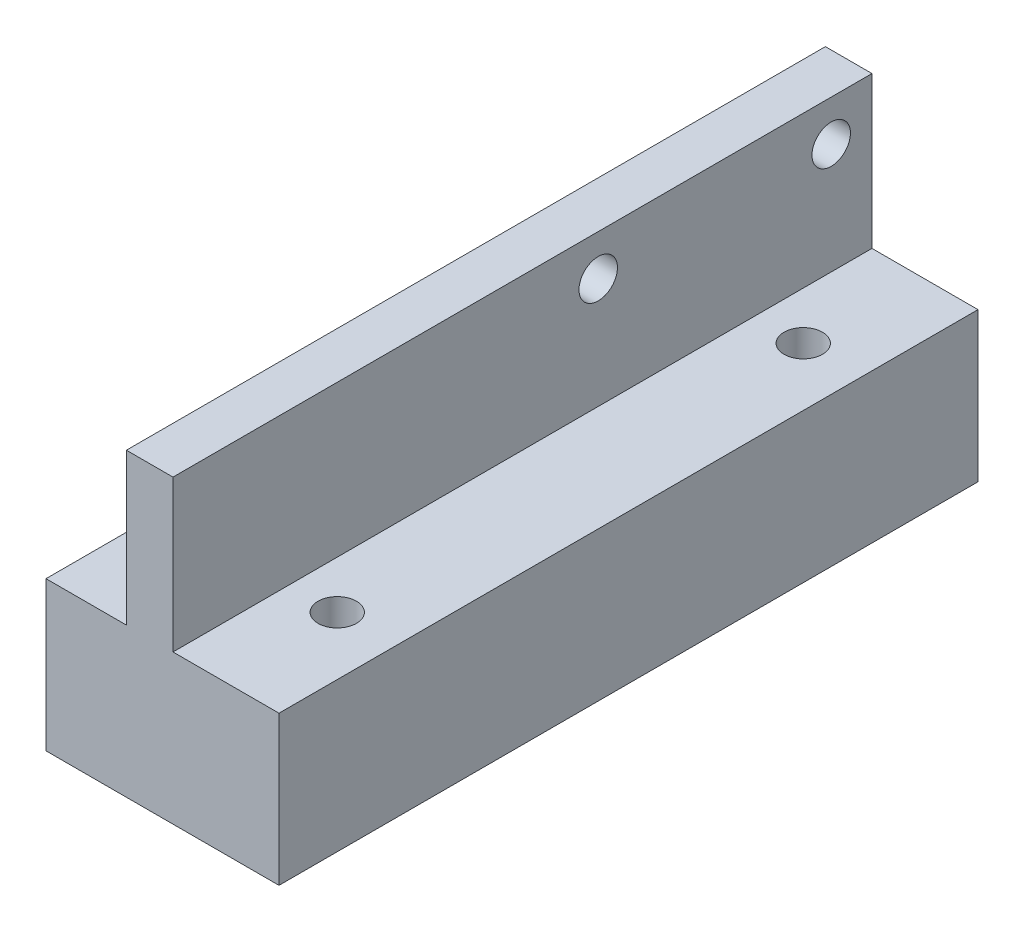
ISO-10303-21;
HEADER;
FILE_DESCRIPTION(('STEP AP214'),'2;1');
FILE_NAME('part.step','',(''),(''),'','','');
FILE_SCHEMA(('AUTOMOTIVE_DESIGN { 1 0 10303 214 1 1 1 1 }'));
ENDSEC;
DATA;
#1=APPLICATION_CONTEXT('core data for automotive mechanical design processes');
#2=APPLICATION_PROTOCOL_DEFINITION('international standard','automotive_design',2000,#1);
#3=PRODUCT_CONTEXT('',#1,'mechanical');
#4=PRODUCT('Part','Part','',(#3));
#5=PRODUCT_RELATED_PRODUCT_CATEGORY('part','',(#4));
#6=PRODUCT_DEFINITION_FORMATION('','',#4);
#7=PRODUCT_DEFINITION_CONTEXT('part definition',#1,'design');
#8=PRODUCT_DEFINITION('design','',#6,#7);
#9=PRODUCT_DEFINITION_SHAPE('','',#8);
#10=(LENGTH_UNIT() NAMED_UNIT(*) SI_UNIT(.MILLI.,.METRE.));
#11=(NAMED_UNIT(*) PLANE_ANGLE_UNIT() SI_UNIT($,.RADIAN.));
#12=(NAMED_UNIT(*) SI_UNIT($,.STERADIAN.) SOLID_ANGLE_UNIT());
#13=UNCERTAINTY_MEASURE_WITH_UNIT(LENGTH_MEASURE(1.E-05),#10,'distance_accuracy_value','');
#14=(GEOMETRIC_REPRESENTATION_CONTEXT(3) GLOBAL_UNCERTAINTY_ASSIGNED_CONTEXT((#13)) GLOBAL_UNIT_ASSIGNED_CONTEXT((#10,
#11,#12)) REPRESENTATION_CONTEXT('',''));
#15=CARTESIAN_POINT('',(0.,0.,0.));
#16=DIRECTION('',(0.,0.,1.));
#17=DIRECTION('',(1.,0.,0.));
#18=AXIS2_PLACEMENT_3D('',#15,#16,#17);
#19=CARTESIAN_POINT('',(0.,12.8,0.));
#20=DIRECTION('',(0.,1.,0.));
#21=DIRECTION('',(0.,0.,1.));
#22=AXIS2_PLACEMENT_3D('',#19,#20,#21);
#23=PLANE('',#22);
#24=DIRECTION('',(0.,0.,-1.));
#25=VECTOR('',#24,1.);
#26=CARTESIAN_POINT('',(0.900000000000003,12.8,-30.));
#27=LINE('',#26,#25);
#28=CARTESIAN_POINT('',(0.900000000000007,12.8,30.));
#29=VERTEX_POINT('',#28);
#30=CARTESIAN_POINT('',(0.900000000000007,12.8,-30.));
#31=VERTEX_POINT('',#30);
#32=EDGE_CURVE('E134',#29,#31,#27,.T.);
#33=ORIENTED_EDGE('',*,*,#32,.F.);
#34=DIRECTION('',(1.,0.,0.));
#35=VECTOR('',#34,1.);
#36=CARTESIAN_POINT('',(10.,12.8,30.));
#37=LINE('',#36,#35);
#38=CARTESIAN_POINT('',(10.,12.8,30.));
#39=VERTEX_POINT('',#38);
#40=EDGE_CURVE('E163',#29,#39,#37,.T.);
#41=ORIENTED_EDGE('',*,*,#40,.T.);
#42=DIRECTION('',(0.,0.,-1.));
#43=VECTOR('',#42,1.);
#44=CARTESIAN_POINT('',(10.,12.8,30.));
#45=LINE('',#44,#43);
#46=CARTESIAN_POINT('',(10.,12.8,-30.));
#47=VERTEX_POINT('',#46);
#48=EDGE_CURVE('E168',#39,#47,#45,.T.);
#49=ORIENTED_EDGE('',*,*,#48,.T.);
#50=DIRECTION('',(-1.,0.,0.));
#51=VECTOR('',#50,1.);
#52=CARTESIAN_POINT('',(10.,12.8,-30.));
#53=LINE('',#52,#51);
#54=EDGE_CURVE('E69',#47,#31,#53,.T.);
#55=ORIENTED_EDGE('',*,*,#54,.T.);
#56=EDGE_LOOP('',(#33,#41,#49,#55));
#57=FACE_BOUND('',#56,.T.);
#58=CARTESIAN_POINT('',(5.,12.8,-20.));
#59=DIRECTION('',(0.,1.,0.));
#60=DIRECTION('',(0.,0.,1.));
#61=AXIS2_PLACEMENT_3D('',#58,#59,#60);
#62=CIRCLE('',#61,1.65);
#63=CARTESIAN_POINT('',(5.,12.8,-18.35));
#64=VERTEX_POINT('',#63);
#65=EDGE_CURVE('E151',#64,#64,#62,.T.);
#66=ORIENTED_EDGE('',*,*,#65,.F.);
#67=EDGE_LOOP('',(#66));
#68=FACE_BOUND('',#67,.T.);
#69=CARTESIAN_POINT('',(5.,12.8,20.));
#70=DIRECTION('',(0.,1.,0.));
#71=DIRECTION('',(0.,0.,1.));
#72=AXIS2_PLACEMENT_3D('',#69,#70,#71);
#73=CIRCLE('',#72,1.65);
#74=CARTESIAN_POINT('',(5.,12.8,21.65));
#75=VERTEX_POINT('',#74);
#76=EDGE_CURVE('E141',#75,#75,#73,.T.);
#77=ORIENTED_EDGE('',*,*,#76,.F.);
#78=EDGE_LOOP('',(#77));
#79=FACE_BOUND('',#78,.T.);
#80=ADVANCED_FACE('F45',(#57,#68,#79),#23,.T.);
#81=DIRECTION('',(0.,0.,1.));
#82=VECTOR('',#81,1.);
#83=CARTESIAN_POINT('',(-3.1,12.8,-30.));
#84=LINE('',#83,#82);
#85=CARTESIAN_POINT('',(-3.09999999999999,12.8,-30.));
#86=VERTEX_POINT('',#85);
#87=CARTESIAN_POINT('',(-3.09999999999999,12.8,30.));
#88=VERTEX_POINT('',#87);
#89=EDGE_CURVE('E61',#86,#88,#84,.T.);
#90=ORIENTED_EDGE('',*,*,#89,.F.);
#91=CARTESIAN_POINT('',(-10.,12.8,-30.));
#92=VERTEX_POINT('',#91);
#93=EDGE_CURVE('E171',#86,#92,#53,.T.);
#94=ORIENTED_EDGE('',*,*,#93,.T.);
#95=DIRECTION('',(0.,0.,1.));
#96=VECTOR('',#95,1.);
#97=CARTESIAN_POINT('',(-10.,12.8,30.));
#98=LINE('',#97,#96);
#99=CARTESIAN_POINT('',(-10.,12.8,30.));
#100=VERTEX_POINT('',#99);
#101=EDGE_CURVE('E159',#92,#100,#98,.T.);
#102=ORIENTED_EDGE('',*,*,#101,.T.);
#103=EDGE_CURVE('E165',#100,#88,#37,.T.);
#104=ORIENTED_EDGE('',*,*,#103,.T.);
#105=EDGE_LOOP('',(#90,#94,#102,#104));
#106=FACE_BOUND('',#105,.T.);
#107=ADVANCED_FACE('F211',(#106),#23,.T.);
#108=CARTESIAN_POINT('',(0.,0.,0.));
#109=DIRECTION('',(0.,1.,0.));
#110=DIRECTION('',(0.,0.,1.));
#111=AXIS2_PLACEMENT_3D('',#108,#109,#110);
#112=PLANE('',#111);
#113=DIRECTION('',(0.,0.,1.));
#114=VECTOR('',#113,1.);
#115=CARTESIAN_POINT('',(-10.,0.,30.));
#116=LINE('',#115,#114);
#117=CARTESIAN_POINT('',(-10.,0.,-30.));
#118=VERTEX_POINT('',#117);
#119=CARTESIAN_POINT('',(-10.,0.,30.));
#120=VERTEX_POINT('',#119);
#121=EDGE_CURVE('E155',#118,#120,#116,.T.);
#122=ORIENTED_EDGE('',*,*,#121,.F.);
#123=DIRECTION('',(-1.,0.,0.));
#124=VECTOR('',#123,1.);
#125=CARTESIAN_POINT('',(10.,0.,-30.));
#126=LINE('',#125,#124);
#127=CARTESIAN_POINT('',(10.,0.,-30.));
#128=VERTEX_POINT('',#127);
#129=EDGE_CURVE('E164',#128,#118,#126,.T.);
#130=ORIENTED_EDGE('',*,*,#129,.F.);
#131=DIRECTION('',(0.,0.,-1.));
#132=VECTOR('',#131,1.);
#133=CARTESIAN_POINT('',(10.,0.,30.));
#134=LINE('',#133,#132);
#135=CARTESIAN_POINT('',(10.,0.,30.));
#136=VERTEX_POINT('',#135);
#137=EDGE_CURVE('E181',#136,#128,#134,.T.);
#138=ORIENTED_EDGE('',*,*,#137,.F.);
#139=DIRECTION('',(1.,0.,0.));
#140=VECTOR('',#139,1.);
#141=CARTESIAN_POINT('',(10.,0.,30.));
#142=LINE('',#141,#140);
#143=EDGE_CURVE('E178',#120,#136,#142,.T.);
#144=ORIENTED_EDGE('',*,*,#143,.F.);
#145=EDGE_LOOP('',(#122,#130,#138,#144));
#146=FACE_BOUND('',#145,.T.);
#147=CARTESIAN_POINT('',(5.,0.,-20.));
#148=DIRECTION('',(0.,1.,0.));
#149=DIRECTION('',(0.,0.,1.));
#150=AXIS2_PLACEMENT_3D('',#147,#148,#149);
#151=CIRCLE('',#150,1.65);
#152=CARTESIAN_POINT('',(5.,0.,-18.35));
#153=VERTEX_POINT('',#152);
#154=EDGE_CURVE('E149',#153,#153,#151,.T.);
#155=ORIENTED_EDGE('',*,*,#154,.T.);
#156=EDGE_LOOP('',(#155));
#157=FACE_BOUND('',#156,.T.);
#158=CARTESIAN_POINT('',(5.,0.,20.));
#159=DIRECTION('',(0.,1.,0.));
#160=DIRECTION('',(0.,0.,1.));
#161=AXIS2_PLACEMENT_3D('',#158,#159,#160);
#162=CIRCLE('',#161,1.65);
#163=CARTESIAN_POINT('',(5.,0.,21.65));
#164=VERTEX_POINT('',#163);
#165=EDGE_CURVE('E136',#164,#164,#162,.T.);
#166=ORIENTED_EDGE('',*,*,#165,.T.);
#167=EDGE_LOOP('',(#166));
#168=FACE_BOUND('',#167,.T.);
#169=ADVANCED_FACE('F205',(#146,#157,#168),#112,.F.);
#170=CARTESIAN_POINT('',(-10.,12.8,30.));
#171=DIRECTION('',(1.,0.,0.));
#172=DIRECTION('',(0.,0.,-1.));
#173=AXIS2_PLACEMENT_3D('',#170,#171,#172);
#174=PLANE('',#173);
#175=ORIENTED_EDGE('',*,*,#121,.T.);
#176=DIRECTION('',(0.,-1.,0.));
#177=VECTOR('',#176,1.);
#178=CARTESIAN_POINT('',(-10.,12.8,30.));
#179=LINE('',#178,#177);
#180=EDGE_CURVE('E11',#100,#120,#179,.T.);
#181=ORIENTED_EDGE('',*,*,#180,.F.);
#182=ORIENTED_EDGE('',*,*,#101,.F.);
#183=DIRECTION('',(0.,-1.,0.));
#184=VECTOR('',#183,1.);
#185=CARTESIAN_POINT('',(-10.,12.8,-30.));
#186=LINE('',#185,#184);
#187=EDGE_CURVE('E174',#92,#118,#186,.T.);
#188=ORIENTED_EDGE('',*,*,#187,.T.);
#189=EDGE_LOOP('',(#175,#181,#182,#188));
#190=FACE_BOUND('',#189,.T.);
#191=ADVANCED_FACE('F47',(#190),#174,.F.);
#192=CARTESIAN_POINT('',(10.,12.8,30.));
#193=DIRECTION('',(0.,0.,-1.));
#194=DIRECTION('',(-1.,0.,0.));
#195=AXIS2_PLACEMENT_3D('',#192,#193,#194);
#196=PLANE('',#195);
#197=ORIENTED_EDGE('',*,*,#143,.T.);
#198=DIRECTION('',(0.,-1.,0.));
#199=VECTOR('',#198,1.);
#200=CARTESIAN_POINT('',(10.,12.8,30.));
#201=LINE('',#200,#199);
#202=EDGE_CURVE('E54',#39,#136,#201,.T.);
#203=ORIENTED_EDGE('',*,*,#202,.F.);
#204=ORIENTED_EDGE('',*,*,#40,.F.);
#205=DIRECTION('',(0.,-1.,0.));
#206=VECTOR('',#205,1.);
#207=CARTESIAN_POINT('',(0.90000000000001,25.8,30.));
#208=LINE('',#207,#206);
#209=CARTESIAN_POINT('',(0.90000000000001,25.8,30.));
#210=VERTEX_POINT('',#209);
#211=EDGE_CURVE('E216',#210,#29,#208,.T.);
#212=ORIENTED_EDGE('',*,*,#211,.F.);
#213=DIRECTION('',(1.,0.,0.));
#214=VECTOR('',#213,1.);
#215=CARTESIAN_POINT('',(0.90000000000001,25.8,30.));
#216=LINE('',#215,#214);
#217=CARTESIAN_POINT('',(-3.09999999999999,25.8,30.));
#218=VERTEX_POINT('',#217);
#219=EDGE_CURVE('E127',#218,#210,#216,.T.);
#220=ORIENTED_EDGE('',*,*,#219,.F.);
#221=DIRECTION('',(0.,-1.,0.));
#222=VECTOR('',#221,1.);
#223=CARTESIAN_POINT('',(-3.09999999999999,25.8,30.));
#224=LINE('',#223,#222);
#225=EDGE_CURVE('E143',#218,#88,#224,.T.);
#226=ORIENTED_EDGE('',*,*,#225,.T.);
#227=ORIENTED_EDGE('',*,*,#103,.F.);
#228=ORIENTED_EDGE('',*,*,#180,.T.);
#229=EDGE_LOOP('',(#197,#203,#204,#212,#220,#226,#227,#228));
#230=FACE_BOUND('',#229,.T.);
#231=ADVANCED_FACE('F215',(#230),#196,.F.);
#232=CARTESIAN_POINT('',(10.,12.8,30.));
#233=DIRECTION('',(-1.,0.,0.));
#234=DIRECTION('',(0.,0.,1.));
#235=AXIS2_PLACEMENT_3D('',#232,#233,#234);
#236=PLANE('',#235);
#237=ORIENTED_EDGE('',*,*,#137,.T.);
#238=DIRECTION('',(0.,-1.,0.));
#239=VECTOR('',#238,1.);
#240=CARTESIAN_POINT('',(10.,12.8,-30.));
#241=LINE('',#240,#239);
#242=EDGE_CURVE('E189',#47,#128,#241,.T.);
#243=ORIENTED_EDGE('',*,*,#242,.F.);
#244=ORIENTED_EDGE('',*,*,#48,.F.);
#245=ORIENTED_EDGE('',*,*,#202,.T.);
#246=EDGE_LOOP('',(#237,#243,#244,#245));
#247=FACE_BOUND('',#246,.T.);
#248=ADVANCED_FACE('F198',(#247),#236,.F.);
#249=CARTESIAN_POINT('',(10.,12.8,-30.));
#250=DIRECTION('',(0.,0.,1.));
#251=DIRECTION('',(1.,0.,0.));
#252=AXIS2_PLACEMENT_3D('',#249,#250,#251);
#253=PLANE('',#252);
#254=ORIENTED_EDGE('',*,*,#129,.T.);
#255=ORIENTED_EDGE('',*,*,#187,.F.);
#256=ORIENTED_EDGE('',*,*,#93,.F.);
#257=DIRECTION('',(0.,-1.,0.));
#258=VECTOR('',#257,1.);
#259=CARTESIAN_POINT('',(-3.1,25.8,-30.));
#260=LINE('',#259,#258);
#261=CARTESIAN_POINT('',(-3.1,25.8,-30.));
#262=VERTEX_POINT('',#261);
#263=EDGE_CURVE('E117',#262,#86,#260,.T.);
#264=ORIENTED_EDGE('',*,*,#263,.F.);
#265=DIRECTION('',(-1.,0.,0.));
#266=VECTOR('',#265,1.);
#267=CARTESIAN_POINT('',(0.900000000000003,25.8,-30.));
#268=LINE('',#267,#266);
#269=CARTESIAN_POINT('',(0.900000000000003,25.8,-30.));
#270=VERTEX_POINT('',#269);
#271=EDGE_CURVE('E110',#270,#262,#268,.T.);
#272=ORIENTED_EDGE('',*,*,#271,.F.);
#273=DIRECTION('',(0.,-1.,0.));
#274=VECTOR('',#273,1.);
#275=CARTESIAN_POINT('',(0.900000000000003,25.8,-30.));
#276=LINE('',#275,#274);
#277=EDGE_CURVE('E114',#270,#31,#276,.T.);
#278=ORIENTED_EDGE('',*,*,#277,.T.);
#279=ORIENTED_EDGE('',*,*,#54,.F.);
#280=ORIENTED_EDGE('',*,*,#242,.T.);
#281=EDGE_LOOP('',(#254,#255,#256,#264,#272,#278,#279,#280));
#282=FACE_BOUND('',#281,.T.);
#283=ADVANCED_FACE('F112',(#282),#253,.F.);
#284=CARTESIAN_POINT('',(5.,12.8,-20.));
#285=DIRECTION('',(0.,-1.,0.));
#286=DIRECTION('',(0.,0.,-1.));
#287=AXIS2_PLACEMENT_3D('',#284,#285,#286);
#288=CYLINDRICAL_SURFACE('',#287,1.65);
#289=ORIENTED_EDGE('',*,*,#65,.T.);
#290=EDGE_LOOP('',(#289));
#291=FACE_BOUND('',#290,.T.);
#292=ORIENTED_EDGE('',*,*,#154,.F.);
#293=EDGE_LOOP('',(#292));
#294=FACE_BOUND('',#293,.T.);
#295=ADVANCED_FACE('F276',(#291,#294),#288,.F.);
#296=CARTESIAN_POINT('',(5.,12.8,20.));
#297=DIRECTION('',(0.,-1.,0.));
#298=DIRECTION('',(0.,0.,-1.));
#299=AXIS2_PLACEMENT_3D('',#296,#297,#298);
#300=CYLINDRICAL_SURFACE('',#299,1.65);
#301=ORIENTED_EDGE('',*,*,#76,.T.);
#302=EDGE_LOOP('',(#301));
#303=FACE_BOUND('',#302,.T.);
#304=ORIENTED_EDGE('',*,*,#165,.F.);
#305=EDGE_LOOP('',(#304));
#306=FACE_BOUND('',#305,.T.);
#307=ADVANCED_FACE('F252',(#303,#306),#300,.F.);
#308=CARTESIAN_POINT('',(0.900000000000003,25.8,-30.));
#309=DIRECTION('',(-1.,0.,0.));
#310=DIRECTION('',(0.,0.,1.));
#311=AXIS2_PLACEMENT_3D('',#308,#309,#310);
#312=PLANE('',#311);
#313=CARTESIAN_POINT('',(0.900000000000006,22.3,-6.5));
#314=DIRECTION('',(1.,0.,0.));
#315=DIRECTION('',(0.,0.,-1.));
#316=AXIS2_PLACEMENT_3D('',#313,#314,#315);
#317=CIRCLE('',#316,1.65);
#318=CARTESIAN_POINT('',(0.900000000000006,22.3,-8.14999999999999));
#319=VERTEX_POINT('',#318);
#320=EDGE_CURVE('E235',#319,#319,#317,.T.);
#321=ORIENTED_EDGE('',*,*,#320,.F.);
#322=EDGE_LOOP('',(#321));
#323=FACE_BOUND('',#322,.T.);
#324=CARTESIAN_POINT('',(0.900000000000004,22.3,-26.5));
#325=DIRECTION('',(1.,0.,0.));
#326=DIRECTION('',(0.,0.,-1.));
#327=AXIS2_PLACEMENT_3D('',#324,#325,#326);
#328=CIRCLE('',#327,1.65);
#329=CARTESIAN_POINT('',(0.900000000000003,22.3,-28.15));
#330=VERTEX_POINT('',#329);
#331=EDGE_CURVE('E231',#330,#330,#328,.T.);
#332=ORIENTED_EDGE('',*,*,#331,.F.);
#333=EDGE_LOOP('',(#332));
#334=FACE_BOUND('',#333,.T.);
#335=ORIENTED_EDGE('',*,*,#32,.T.);
#336=ORIENTED_EDGE('',*,*,#277,.F.);
#337=DIRECTION('',(0.,0.,-1.));
#338=VECTOR('',#337,1.);
#339=CARTESIAN_POINT('',(0.900000000000003,25.8,-30.));
#340=LINE('',#339,#338);
#341=EDGE_CURVE('E122',#210,#270,#340,.T.);
#342=ORIENTED_EDGE('',*,*,#341,.F.);
#343=ORIENTED_EDGE('',*,*,#211,.T.);
#344=EDGE_LOOP('',(#335,#336,#342,#343));
#345=FACE_BOUND('',#344,.T.);
#346=ADVANCED_FACE('F133',(#323,#334,#345),#312,.F.);
#347=CARTESIAN_POINT('',(-3.1,25.8,-30.));
#348=DIRECTION('',(1.,0.,0.));
#349=DIRECTION('',(0.,0.,-1.));
#350=AXIS2_PLACEMENT_3D('',#347,#348,#349);
#351=PLANE('',#350);
#352=CARTESIAN_POINT('',(-3.09999999999999,22.3,-6.5));
#353=DIRECTION('',(1.,0.,0.));
#354=DIRECTION('',(0.,0.,-1.));
#355=AXIS2_PLACEMENT_3D('',#352,#353,#354);
#356=CIRCLE('',#355,1.65);
#357=CARTESIAN_POINT('',(-3.09999999999999,22.3,-8.14999999999999));
#358=VERTEX_POINT('',#357);
#359=EDGE_CURVE('E227',#358,#358,#356,.F.);
#360=ORIENTED_EDGE('',*,*,#359,.F.);
#361=EDGE_LOOP('',(#360));
#362=FACE_BOUND('',#361,.T.);
#363=CARTESIAN_POINT('',(-3.1,22.3,-26.5));
#364=DIRECTION('',(1.,0.,0.));
#365=DIRECTION('',(0.,0.,-1.));
#366=AXIS2_PLACEMENT_3D('',#363,#364,#365);
#367=CIRCLE('',#366,1.65);
#368=CARTESIAN_POINT('',(-3.1,22.3,-28.15));
#369=VERTEX_POINT('',#368);
#370=EDGE_CURVE('E236',#369,#369,#367,.F.);
#371=ORIENTED_EDGE('',*,*,#370,.F.);
#372=EDGE_LOOP('',(#371));
#373=FACE_BOUND('',#372,.T.);
#374=ORIENTED_EDGE('',*,*,#89,.T.);
#375=ORIENTED_EDGE('',*,*,#225,.F.);
#376=DIRECTION('',(0.,0.,1.));
#377=VECTOR('',#376,1.);
#378=CARTESIAN_POINT('',(-3.1,25.8,-30.));
#379=LINE('',#378,#377);
#380=EDGE_CURVE('E121',#262,#218,#379,.T.);
#381=ORIENTED_EDGE('',*,*,#380,.F.);
#382=ORIENTED_EDGE('',*,*,#263,.T.);
#383=EDGE_LOOP('',(#374,#375,#381,#382));
#384=FACE_BOUND('',#383,.T.);
#385=ADVANCED_FACE('F251',(#362,#373,#384),#351,.F.);
#386=CARTESIAN_POINT('',(0.,25.8,0.));
#387=DIRECTION('',(0.,-1.,0.));
#388=DIRECTION('',(0.,0.,-1.));
#389=AXIS2_PLACEMENT_3D('',#386,#387,#388);
#390=PLANE('',#389);
#391=ORIENTED_EDGE('',*,*,#341,.T.);
#392=ORIENTED_EDGE('',*,*,#271,.T.);
#393=ORIENTED_EDGE('',*,*,#380,.T.);
#394=ORIENTED_EDGE('',*,*,#219,.T.);
#395=EDGE_LOOP('',(#391,#392,#393,#394));
#396=FACE_BOUND('',#395,.T.);
#397=ADVANCED_FACE('F125',(#396),#390,.F.);
#398=CARTESIAN_POINT('',(-7.7669047558312,22.3,-26.5));
#399=DIRECTION('',(1.,0.,0.));
#400=DIRECTION('',(0.,0.,-1.));
#401=AXIS2_PLACEMENT_3D('',#398,#399,#400);
#402=CYLINDRICAL_SURFACE('',#401,1.65);
#403=ORIENTED_EDGE('',*,*,#370,.T.);
#404=EDGE_LOOP('',(#403));
#405=FACE_BOUND('',#404,.T.);
#406=ORIENTED_EDGE('',*,*,#331,.T.);
#407=EDGE_LOOP('',(#406));
#408=FACE_BOUND('',#407,.T.);
#409=ADVANCED_FACE('F256',(#405,#408),#402,.F.);
#410=CARTESIAN_POINT('',(-7.7669047558312,22.3,-6.49999999999999));
#411=DIRECTION('',(1.,0.,0.));
#412=DIRECTION('',(0.,0.,-1.));
#413=AXIS2_PLACEMENT_3D('',#410,#411,#412);
#414=CYLINDRICAL_SURFACE('',#413,1.65);
#415=ORIENTED_EDGE('',*,*,#359,.T.);
#416=EDGE_LOOP('',(#415));
#417=FACE_BOUND('',#416,.T.);
#418=ORIENTED_EDGE('',*,*,#320,.T.);
#419=EDGE_LOOP('',(#418));
#420=FACE_BOUND('',#419,.T.);
#421=ADVANCED_FACE('F247',(#417,#420),#414,.F.);
#422=CLOSED_SHELL('',(#80,#107,#169,#191,#231,#248,#283,#295,#307,#346,#385,#397,#409,#421));
#423=MANIFOLD_SOLID_BREP('B2',#422);
#424=ADVANCED_BREP_SHAPE_REPRESENTATION('',(#18,#423),#14);
#425=SHAPE_DEFINITION_REPRESENTATION(#9,#424);
ENDSEC;
END-ISO-10303-21;
